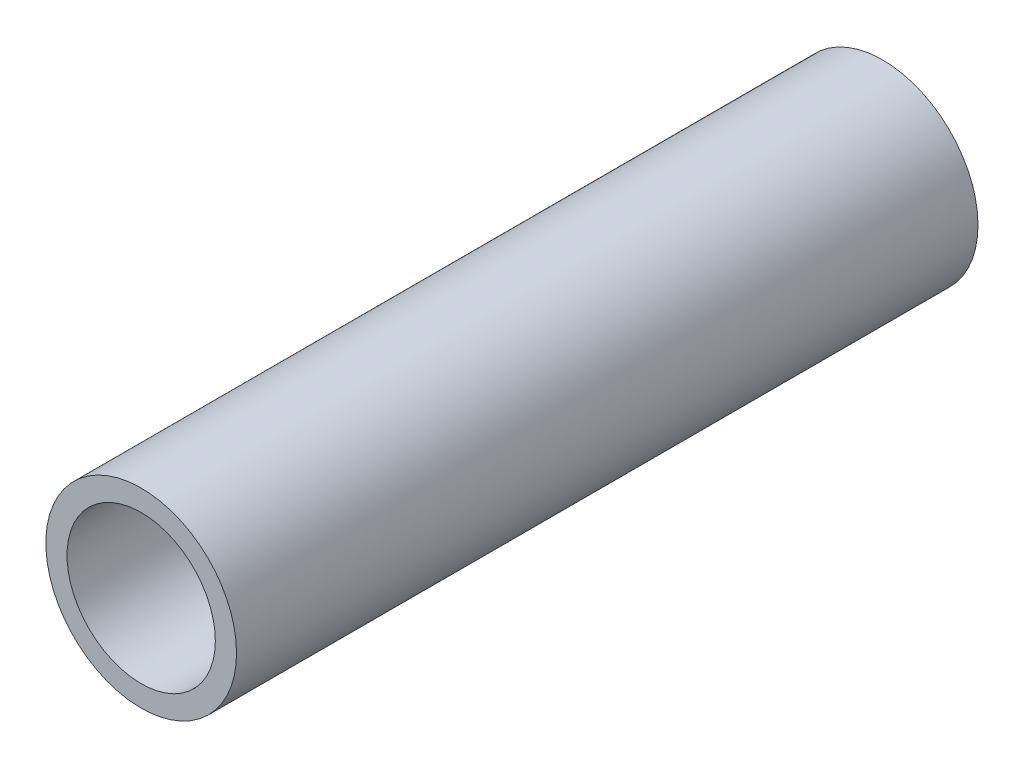
ISO-10303-21;
HEADER;
FILE_DESCRIPTION(('STEP AP214'),'2;1');
FILE_NAME('part.step','',(''),(''),'','','');
FILE_SCHEMA(('AUTOMOTIVE_DESIGN { 1 0 10303 214 1 1 1 1 }'));
ENDSEC;
DATA;
#1=APPLICATION_CONTEXT('core data for automotive mechanical design processes');
#2=APPLICATION_PROTOCOL_DEFINITION('international standard','automotive_design',2000,#1);
#3=PRODUCT_CONTEXT('',#1,'mechanical');
#4=PRODUCT('Part','Part','',(#3));
#5=PRODUCT_RELATED_PRODUCT_CATEGORY('part','',(#4));
#6=PRODUCT_DEFINITION_FORMATION('','',#4);
#7=PRODUCT_DEFINITION_CONTEXT('part definition',#1,'design');
#8=PRODUCT_DEFINITION('design','',#6,#7);
#9=PRODUCT_DEFINITION_SHAPE('','',#8);
#10=(LENGTH_UNIT() NAMED_UNIT(*) SI_UNIT(.MILLI.,.METRE.));
#11=(NAMED_UNIT(*) PLANE_ANGLE_UNIT() SI_UNIT($,.RADIAN.));
#12=(NAMED_UNIT(*) SI_UNIT($,.STERADIAN.) SOLID_ANGLE_UNIT());
#13=UNCERTAINTY_MEASURE_WITH_UNIT(LENGTH_MEASURE(1.E-05),#10,'distance_accuracy_value','');
#14=(GEOMETRIC_REPRESENTATION_CONTEXT(3) GLOBAL_UNCERTAINTY_ASSIGNED_CONTEXT((#13)) GLOBAL_UNIT_ASSIGNED_CONTEXT((#10,
#11,#12)) REPRESENTATION_CONTEXT('',''));
#15=CARTESIAN_POINT('',(0.,0.,0.));
#16=DIRECTION('',(0.,0.,1.));
#17=DIRECTION('',(1.,0.,0.));
#18=AXIS2_PLACEMENT_3D('',#15,#16,#17);
#19=CARTESIAN_POINT('',(0.,0.,0.));
#20=DIRECTION('',(0.,0.,1.));
#21=DIRECTION('',(1.,0.,0.));
#22=AXIS2_PLACEMENT_3D('',#19,#20,#21);
#23=CYLINDRICAL_SURFACE('',#22,9.);
#24=CARTESIAN_POINT('',(0.,0.,0.));
#25=DIRECTION('',(0.,0.,1.));
#26=DIRECTION('',(1.,0.,0.));
#27=AXIS2_PLACEMENT_3D('',#24,#25,#26);
#28=CIRCLE('',#27,9.);
#29=CARTESIAN_POINT('',(9.,0.,0.));
#30=VERTEX_POINT('',#29);
#31=EDGE_CURVE('E10',#30,#30,#28,.T.);
#32=ORIENTED_EDGE('',*,*,#31,.T.);
#33=EDGE_LOOP('',(#32));
#34=FACE_BOUND('',#33,.T.);
#35=CARTESIAN_POINT('',(0.,0.,70.));
#36=DIRECTION('',(0.,0.,1.));
#37=DIRECTION('',(1.,0.,0.));
#38=AXIS2_PLACEMENT_3D('',#35,#36,#37);
#39=CIRCLE('',#38,9.);
#40=CARTESIAN_POINT('',(9.,0.,70.));
#41=VERTEX_POINT('',#40);
#42=EDGE_CURVE('E48',#41,#41,#39,.T.);
#43=ORIENTED_EDGE('',*,*,#42,.F.);
#44=EDGE_LOOP('',(#43));
#45=FACE_BOUND('',#44,.T.);
#46=ADVANCED_FACE('F34',(#34,#45),#23,.T.);
#47=CARTESIAN_POINT('',(9.,0.,0.));
#48=DIRECTION('',(0.,0.,-1.));
#49=DIRECTION('',(-1.,0.,0.));
#50=AXIS2_PLACEMENT_3D('',#47,#48,#49);
#51=PLANE('',#50);
#52=CARTESIAN_POINT('',(0.,0.,0.));
#53=DIRECTION('',(0.,0.,1.));
#54=DIRECTION('',(1.,0.,0.));
#55=AXIS2_PLACEMENT_3D('',#52,#53,#54);
#56=CIRCLE('',#55,7.);
#57=CARTESIAN_POINT('',(7.,0.,0.));
#58=VERTEX_POINT('',#57);
#59=EDGE_CURVE('E40',#58,#58,#56,.T.);
#60=ORIENTED_EDGE('',*,*,#59,.T.);
#61=EDGE_LOOP('',(#60));
#62=FACE_BOUND('',#61,.T.);
#63=ORIENTED_EDGE('',*,*,#31,.F.);
#64=EDGE_LOOP('',(#63));
#65=FACE_BOUND('',#64,.T.);
#66=ADVANCED_FACE('F58',(#62,#65),#51,.T.);
#67=CARTESIAN_POINT('',(0.,0.,0.));
#68=DIRECTION('',(0.,0.,1.));
#69=DIRECTION('',(1.,0.,0.));
#70=AXIS2_PLACEMENT_3D('',#67,#68,#69);
#71=CYLINDRICAL_SURFACE('',#70,7.);
#72=CARTESIAN_POINT('',(0.,0.,70.));
#73=DIRECTION('',(0.,0.,1.));
#74=DIRECTION('',(1.,0.,0.));
#75=AXIS2_PLACEMENT_3D('',#72,#73,#74);
#76=CIRCLE('',#75,7.);
#77=CARTESIAN_POINT('',(7.,0.,70.));
#78=VERTEX_POINT('',#77);
#79=EDGE_CURVE('E44',#78,#78,#76,.T.);
#80=ORIENTED_EDGE('',*,*,#79,.T.);
#81=EDGE_LOOP('',(#80));
#82=FACE_BOUND('',#81,.T.);
#83=ORIENTED_EDGE('',*,*,#59,.F.);
#84=EDGE_LOOP('',(#83));
#85=FACE_BOUND('',#84,.T.);
#86=ADVANCED_FACE('F62',(#82,#85),#71,.F.);
#87=CARTESIAN_POINT('',(7.,0.,70.));
#88=DIRECTION('',(0.,0.,1.));
#89=DIRECTION('',(1.,0.,0.));
#90=AXIS2_PLACEMENT_3D('',#87,#88,#89);
#91=PLANE('',#90);
#92=ORIENTED_EDGE('',*,*,#42,.T.);
#93=EDGE_LOOP('',(#92));
#94=FACE_BOUND('',#93,.T.);
#95=ORIENTED_EDGE('',*,*,#79,.F.);
#96=EDGE_LOOP('',(#95));
#97=FACE_BOUND('',#96,.T.);
#98=ADVANCED_FACE('F54',(#94,#97),#91,.T.);
#99=CLOSED_SHELL('',(#46,#66,#86,#98));
#100=MANIFOLD_SOLID_BREP('B2',#99);
#101=ADVANCED_BREP_SHAPE_REPRESENTATION('',(#18,#100),#14);
#102=SHAPE_DEFINITION_REPRESENTATION(#9,#101);
ENDSEC;
END-ISO-10303-21;
